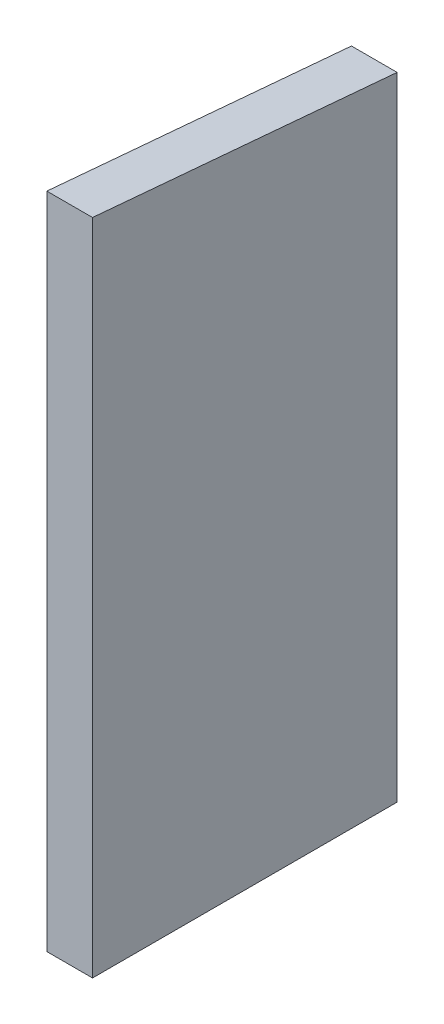
ISO-10303-21;
HEADER;
FILE_DESCRIPTION(('STEP AP214'),'2;1');
FILE_NAME('part.step','',(''),(''),'','','');
FILE_SCHEMA(('AUTOMOTIVE_DESIGN { 1 0 10303 214 1 1 1 1 }'));
ENDSEC;
DATA;
#1=APPLICATION_CONTEXT('core data for automotive mechanical design processes');
#2=APPLICATION_PROTOCOL_DEFINITION('international standard','automotive_design',2000,#1);
#3=PRODUCT_CONTEXT('',#1,'mechanical');
#4=PRODUCT('Part','Part','',(#3));
#5=PRODUCT_RELATED_PRODUCT_CATEGORY('part','',(#4));
#6=PRODUCT_DEFINITION_FORMATION('','',#4);
#7=PRODUCT_DEFINITION_CONTEXT('part definition',#1,'design');
#8=PRODUCT_DEFINITION('design','',#6,#7);
#9=PRODUCT_DEFINITION_SHAPE('','',#8);
#10=(LENGTH_UNIT() NAMED_UNIT(*) SI_UNIT(.MILLI.,.METRE.));
#11=(NAMED_UNIT(*) PLANE_ANGLE_UNIT() SI_UNIT($,.RADIAN.));
#12=(NAMED_UNIT(*) SI_UNIT($,.STERADIAN.) SOLID_ANGLE_UNIT());
#13=UNCERTAINTY_MEASURE_WITH_UNIT(LENGTH_MEASURE(1.E-05),#10,'distance_accuracy_value','');
#14=(GEOMETRIC_REPRESENTATION_CONTEXT(3) GLOBAL_UNCERTAINTY_ASSIGNED_CONTEXT((#13)) GLOBAL_UNIT_ASSIGNED_CONTEXT((#10,
#11,#12)) REPRESENTATION_CONTEXT('',''));
#15=CARTESIAN_POINT('',(0.,0.,0.));
#16=DIRECTION('',(0.,0.,1.));
#17=DIRECTION('',(1.,0.,0.));
#18=AXIS2_PLACEMENT_3D('',#15,#16,#17);
#19=CARTESIAN_POINT('',(7.5,250.,50.));
#20=DIRECTION('',(-1.,0.,0.));
#21=DIRECTION('',(0.,0.,1.));
#22=AXIS2_PLACEMENT_3D('',#19,#20,#21);
#23=PLANE('',#22);
#24=DIRECTION('',(0.,-1.,0.));
#25=VECTOR('',#24,1.);
#26=CARTESIAN_POINT('',(7.5,250.,-50.));
#27=LINE('',#26,#25);
#28=CARTESIAN_POINT('',(7.5,207.453464560454,-50.));
#29=VERTEX_POINT('',#28);
#30=CARTESIAN_POINT('',(7.5,0.,-50.));
#31=VERTEX_POINT('',#30);
#32=EDGE_CURVE('E11',#29,#31,#27,.T.);
#33=ORIENTED_EDGE('',*,*,#32,.F.);
#34=DIRECTION('',(0.,-0.0871557427476543,-0.996194698091746));
#35=VECTOR('',#34,1.);
#36=CARTESIAN_POINT('',(7.5,216.202330913046,50.));
#37=LINE('',#36,#35);
#38=CARTESIAN_POINT('',(7.5,216.202330913046,50.));
#39=VERTEX_POINT('',#38);
#40=EDGE_CURVE('E79',#39,#29,#37,.T.);
#41=ORIENTED_EDGE('',*,*,#40,.F.);
#42=DIRECTION('',(0.,-1.,0.));
#43=VECTOR('',#42,1.);
#44=CARTESIAN_POINT('',(7.5,250.,50.));
#45=LINE('',#44,#43);
#46=CARTESIAN_POINT('',(7.5,0.,50.));
#47=VERTEX_POINT('',#46);
#48=EDGE_CURVE('E60',#39,#47,#45,.T.);
#49=ORIENTED_EDGE('',*,*,#48,.T.);
#50=DIRECTION('',(0.,0.,-1.));
#51=VECTOR('',#50,1.);
#52=CARTESIAN_POINT('',(7.5,0.,50.));
#53=LINE('',#52,#51);
#54=EDGE_CURVE('E83',#47,#31,#53,.T.);
#55=ORIENTED_EDGE('',*,*,#54,.T.);
#56=EDGE_LOOP('',(#33,#41,#49,#55));
#57=FACE_BOUND('',#56,.T.);
#58=ADVANCED_FACE('F38',(#57),#23,.F.);
#59=CARTESIAN_POINT('',(-7.5,250.,-50.));
#60=DIRECTION('',(0.,0.,1.));
#61=DIRECTION('',(1.,0.,0.));
#62=AXIS2_PLACEMENT_3D('',#59,#60,#61);
#63=PLANE('',#62);
#64=DIRECTION('',(0.,-1.,0.));
#65=VECTOR('',#64,1.);
#66=CARTESIAN_POINT('',(-7.5,250.,-50.));
#67=LINE('',#66,#65);
#68=CARTESIAN_POINT('',(-7.5,207.453464560454,-50.));
#69=VERTEX_POINT('',#68);
#70=CARTESIAN_POINT('',(-7.5,0.,-50.));
#71=VERTEX_POINT('',#70);
#72=EDGE_CURVE('E45',#69,#71,#67,.T.);
#73=ORIENTED_EDGE('',*,*,#72,.F.);
#74=DIRECTION('',(1.,0.,0.));
#75=VECTOR('',#74,1.);
#76=CARTESIAN_POINT('',(-7.5,207.453464560454,-50.));
#77=LINE('',#76,#75);
#78=EDGE_CURVE('E77',#69,#29,#77,.T.);
#79=ORIENTED_EDGE('',*,*,#78,.T.);
#80=ORIENTED_EDGE('',*,*,#32,.T.);
#81=DIRECTION('',(-1.,0.,0.));
#82=VECTOR('',#81,1.);
#83=CARTESIAN_POINT('',(-7.5,0.,-50.));
#84=LINE('',#83,#82);
#85=EDGE_CURVE('E95',#31,#71,#84,.T.);
#86=ORIENTED_EDGE('',*,*,#85,.T.);
#87=EDGE_LOOP('',(#73,#79,#80,#86));
#88=FACE_BOUND('',#87,.T.);
#89=ADVANCED_FACE('F93',(#88),#63,.F.);
#90=CARTESIAN_POINT('',(-7.5,250.,50.));
#91=DIRECTION('',(1.,0.,0.));
#92=DIRECTION('',(0.,0.,-1.));
#93=AXIS2_PLACEMENT_3D('',#90,#91,#92);
#94=PLANE('',#93);
#95=DIRECTION('',(0.,-1.,0.));
#96=VECTOR('',#95,1.);
#97=CARTESIAN_POINT('',(-7.5,250.,50.));
#98=LINE('',#97,#96);
#99=CARTESIAN_POINT('',(-7.5,216.202330913046,50.));
#100=VERTEX_POINT('',#99);
#101=CARTESIAN_POINT('',(-7.5,0.,50.));
#102=VERTEX_POINT('',#101);
#103=EDGE_CURVE('E91',#100,#102,#98,.T.);
#104=ORIENTED_EDGE('',*,*,#103,.F.);
#105=DIRECTION('',(0.,-0.0871557427476543,-0.996194698091746));
#106=VECTOR('',#105,1.);
#107=CARTESIAN_POINT('',(-7.5,216.202330913046,50.));
#108=LINE('',#107,#106);
#109=EDGE_CURVE('E52',#100,#69,#108,.T.);
#110=ORIENTED_EDGE('',*,*,#109,.T.);
#111=ORIENTED_EDGE('',*,*,#72,.T.);
#112=DIRECTION('',(0.,0.,1.));
#113=VECTOR('',#112,1.);
#114=CARTESIAN_POINT('',(-7.5,0.,50.));
#115=LINE('',#114,#113);
#116=EDGE_CURVE('E102',#71,#102,#115,.T.);
#117=ORIENTED_EDGE('',*,*,#116,.T.);
#118=EDGE_LOOP('',(#104,#110,#111,#117));
#119=FACE_BOUND('',#118,.T.);
#120=ADVANCED_FACE('F88',(#119),#94,.F.);
#121=CARTESIAN_POINT('',(-7.5,250.,50.));
#122=DIRECTION('',(0.,0.,-1.));
#123=DIRECTION('',(-1.,0.,0.));
#124=AXIS2_PLACEMENT_3D('',#121,#122,#123);
#125=PLANE('',#124);
#126=ORIENTED_EDGE('',*,*,#48,.F.);
#127=DIRECTION('',(1.,0.,0.));
#128=VECTOR('',#127,1.);
#129=CARTESIAN_POINT('',(-7.5,216.202330913046,50.));
#130=LINE('',#129,#128);
#131=EDGE_CURVE('E84',#100,#39,#130,.T.);
#132=ORIENTED_EDGE('',*,*,#131,.F.);
#133=ORIENTED_EDGE('',*,*,#103,.T.);
#134=DIRECTION('',(1.,0.,0.));
#135=VECTOR('',#134,1.);
#136=CARTESIAN_POINT('',(-7.5,0.,50.));
#137=LINE('',#136,#135);
#138=EDGE_CURVE('E100',#102,#47,#137,.T.);
#139=ORIENTED_EDGE('',*,*,#138,.T.);
#140=EDGE_LOOP('',(#126,#132,#133,#139));
#141=FACE_BOUND('',#140,.T.);
#142=ADVANCED_FACE('F108',(#141),#125,.F.);
#143=CARTESIAN_POINT('',(0.,0.,0.));
#144=DIRECTION('',(0.,-1.,0.));
#145=DIRECTION('',(0.,0.,-1.));
#146=AXIS2_PLACEMENT_3D('',#143,#144,#145);
#147=PLANE('',#146);
#148=ORIENTED_EDGE('',*,*,#54,.F.);
#149=ORIENTED_EDGE('',*,*,#138,.F.);
#150=ORIENTED_EDGE('',*,*,#116,.F.);
#151=ORIENTED_EDGE('',*,*,#85,.F.);
#152=EDGE_LOOP('',(#148,#149,#150,#151));
#153=FACE_BOUND('',#152,.T.);
#154=ADVANCED_FACE('F112',(#153),#147,.T.);
#155=CARTESIAN_POINT('',(-7.5,216.202330913046,50.));
#156=DIRECTION('',(0.,-0.996194698091746,0.0871557427476543));
#157=DIRECTION('',(0.,-0.0871557427476543,-0.996194698091746));
#158=AXIS2_PLACEMENT_3D('',#155,#156,#157);
#159=PLANE('',#158);
#160=ORIENTED_EDGE('',*,*,#40,.T.);
#161=ORIENTED_EDGE('',*,*,#78,.F.);
#162=ORIENTED_EDGE('',*,*,#109,.F.);
#163=ORIENTED_EDGE('',*,*,#131,.T.);
#164=EDGE_LOOP('',(#160,#161,#162,#163));
#165=FACE_BOUND('',#164,.T.);
#166=ADVANCED_FACE('F78',(#165),#159,.F.);
#167=CLOSED_SHELL('',(#58,#89,#120,#142,#154,#166));
#168=MANIFOLD_SOLID_BREP('B2',#167);
#169=ADVANCED_BREP_SHAPE_REPRESENTATION('',(#18,#168),#14);
#170=SHAPE_DEFINITION_REPRESENTATION(#9,#169);
ENDSEC;
END-ISO-10303-21;
